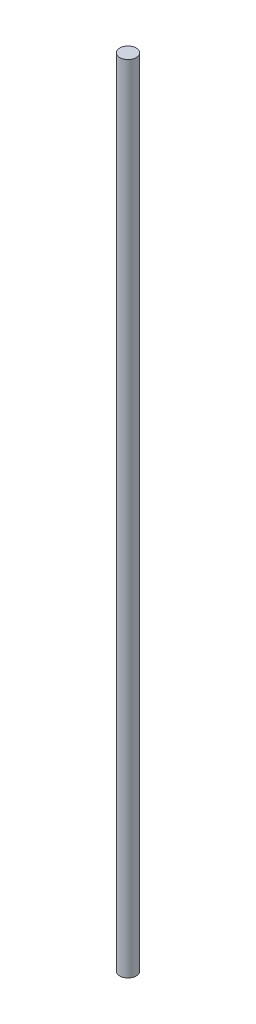
ISO-10303-21;
HEADER;
FILE_DESCRIPTION(('STEP AP214'),'2;1');
FILE_NAME('part.step','',(''),(''),'','','');
FILE_SCHEMA(('AUTOMOTIVE_DESIGN { 1 0 10303 214 1 1 1 1 }'));
ENDSEC;
DATA;
#1=APPLICATION_CONTEXT('core data for automotive mechanical design processes');
#2=APPLICATION_PROTOCOL_DEFINITION('international standard','automotive_design',2000,#1);
#3=PRODUCT_CONTEXT('',#1,'mechanical');
#4=PRODUCT('Part','Part','',(#3));
#5=PRODUCT_RELATED_PRODUCT_CATEGORY('part','',(#4));
#6=PRODUCT_DEFINITION_FORMATION('','',#4);
#7=PRODUCT_DEFINITION_CONTEXT('part definition',#1,'design');
#8=PRODUCT_DEFINITION('design','',#6,#7);
#9=PRODUCT_DEFINITION_SHAPE('','',#8);
#10=(LENGTH_UNIT() NAMED_UNIT(*) SI_UNIT(.MILLI.,.METRE.));
#11=(NAMED_UNIT(*) PLANE_ANGLE_UNIT() SI_UNIT($,.RADIAN.));
#12=(NAMED_UNIT(*) SI_UNIT($,.STERADIAN.) SOLID_ANGLE_UNIT());
#13=UNCERTAINTY_MEASURE_WITH_UNIT(LENGTH_MEASURE(1.E-05),#10,'distance_accuracy_value','');
#14=(GEOMETRIC_REPRESENTATION_CONTEXT(3) GLOBAL_UNCERTAINTY_ASSIGNED_CONTEXT((#13)) GLOBAL_UNIT_ASSIGNED_CONTEXT((#10,
#11,#12)) REPRESENTATION_CONTEXT('',''));
#15=CARTESIAN_POINT('',(0.,0.,0.));
#16=DIRECTION('',(0.,0.,1.));
#17=DIRECTION('',(1.,0.,0.));
#18=AXIS2_PLACEMENT_3D('',#15,#16,#17);
#19=CARTESIAN_POINT('',(-66.8787217069615,304.8,-2.26067909280263));
#20=DIRECTION('',(0.,-1.,0.));
#21=DIRECTION('',(0.,0.,-1.));
#22=AXIS2_PLACEMENT_3D('',#19,#20,#21);
#23=CYLINDRICAL_SURFACE('',#22,3.175);
#24=CARTESIAN_POINT('',(-66.8787217069615,304.8,-2.26067909280263));
#25=DIRECTION('',(0.,1.,0.));
#26=DIRECTION('',(0.,0.,1.));
#27=AXIS2_PLACEMENT_3D('',#24,#25,#26);
#28=CIRCLE('',#27,3.175);
#29=CARTESIAN_POINT('',(-66.8787217069615,304.8,-5.43567909280262));
#30=VERTEX_POINT('',#29);
#31=EDGE_CURVE('E10',#30,#30,#28,.T.);
#32=CARTESIAN_POINT('',(-66.8787217069615,0.,-2.26067909280263));
#33=DIRECTION('',(0.,1.,0.));
#34=DIRECTION('',(0.,0.,1.));
#35=AXIS2_PLACEMENT_3D('',#32,#33,#34);
#36=CIRCLE('',#35,3.175);
#37=CARTESIAN_POINT('',(-66.8787217069615,0.,-5.43567909280262));
#38=VERTEX_POINT('',#37);
#39=EDGE_CURVE('E33',#38,#38,#36,.T.);
#40=CARTESIAN_POINT('',(-66.8787217069615,304.8,-5.43567909280262));
#41=CARTESIAN_POINT('',(-66.8787217069615,301.625,-5.43567909280262));
#42=CARTESIAN_POINT('',(-66.8787217069615,298.45,-5.43567909280262));
#43=CARTESIAN_POINT('',(-66.8787217069615,292.1,-5.43567909280262));
#44=CARTESIAN_POINT('',(-66.8787217069615,288.925,-5.43567909280262));
#45=CARTESIAN_POINT('',(-66.8787217069615,282.575,-5.43567909280262));
#46=CARTESIAN_POINT('',(-66.8787217069615,279.4,-5.43567909280262));
#47=CARTESIAN_POINT('',(-66.8787217069615,273.05,-5.43567909280262));
#48=CARTESIAN_POINT('',(-66.8787217069615,269.875,-5.43567909280262));
#49=CARTESIAN_POINT('',(-66.8787217069615,263.525,-5.43567909280262));
#50=CARTESIAN_POINT('',(-66.8787217069615,260.35,-5.43567909280262));
#51=CARTESIAN_POINT('',(-66.8787217069615,254.,-5.43567909280262));
#52=CARTESIAN_POINT('',(-66.8787217069615,250.825,-5.43567909280262));
#53=CARTESIAN_POINT('',(-66.8787217069615,244.475,-5.43567909280262));
#54=CARTESIAN_POINT('',(-66.8787217069615,241.3,-5.43567909280262));
#55=CARTESIAN_POINT('',(-66.8787217069615,234.95,-5.43567909280262));
#56=CARTESIAN_POINT('',(-66.8787217069615,231.775,-5.43567909280262));
#57=CARTESIAN_POINT('',(-66.8787217069615,225.425,-5.43567909280262));
#58=CARTESIAN_POINT('',(-66.8787217069615,222.25,-5.43567909280262));
#59=CARTESIAN_POINT('',(-66.8787217069615,215.9,-5.43567909280262));
#60=CARTESIAN_POINT('',(-66.8787217069615,212.725,-5.43567909280262));
#61=CARTESIAN_POINT('',(-66.8787217069615,206.375,-5.43567909280262));
#62=CARTESIAN_POINT('',(-66.8787217069615,203.2,-5.43567909280262));
#63=CARTESIAN_POINT('',(-66.8787217069615,196.85,-5.43567909280262));
#64=CARTESIAN_POINT('',(-66.8787217069615,193.675,-5.43567909280262));
#65=CARTESIAN_POINT('',(-66.8787217069615,187.325,-5.43567909280262));
#66=CARTESIAN_POINT('',(-66.8787217069615,184.15,-5.43567909280262));
#67=CARTESIAN_POINT('',(-66.8787217069615,177.8,-5.43567909280262));
#68=CARTESIAN_POINT('',(-66.8787217069615,174.625,-5.43567909280262));
#69=CARTESIAN_POINT('',(-66.8787217069615,168.275,-5.43567909280262));
#70=CARTESIAN_POINT('',(-66.8787217069615,165.1,-5.43567909280262));
#71=CARTESIAN_POINT('',(-66.8787217069615,158.75,-5.43567909280262));
#72=CARTESIAN_POINT('',(-66.8787217069615,155.575,-5.43567909280262));
#73=CARTESIAN_POINT('',(-66.8787217069615,149.225,-5.43567909280262));
#74=CARTESIAN_POINT('',(-66.8787217069615,146.05,-5.43567909280262));
#75=CARTESIAN_POINT('',(-66.8787217069615,139.7,-5.43567909280262));
#76=CARTESIAN_POINT('',(-66.8787217069615,136.525,-5.43567909280262));
#77=CARTESIAN_POINT('',(-66.8787217069615,130.175,-5.43567909280262));
#78=CARTESIAN_POINT('',(-66.8787217069615,127.,-5.43567909280262));
#79=CARTESIAN_POINT('',(-66.8787217069615,120.65,-5.43567909280262));
#80=CARTESIAN_POINT('',(-66.8787217069615,117.475,-5.43567909280262));
#81=CARTESIAN_POINT('',(-66.8787217069615,111.125,-5.43567909280262));
#82=CARTESIAN_POINT('',(-66.8787217069615,107.95,-5.43567909280262));
#83=CARTESIAN_POINT('',(-66.8787217069615,101.6,-5.43567909280262));
#84=CARTESIAN_POINT('',(-66.8787217069615,98.425,-5.43567909280262));
#85=CARTESIAN_POINT('',(-66.8787217069615,92.075,-5.43567909280262));
#86=CARTESIAN_POINT('',(-66.8787217069615,88.9,-5.43567909280262));
#87=CARTESIAN_POINT('',(-66.8787217069615,82.55,-5.43567909280262));
#88=CARTESIAN_POINT('',(-66.8787217069615,79.375,-5.43567909280262));
#89=CARTESIAN_POINT('',(-66.8787217069615,73.025,-5.43567909280262));
#90=CARTESIAN_POINT('',(-66.8787217069615,69.85,-5.43567909280262));
#91=CARTESIAN_POINT('',(-66.8787217069615,63.5,-5.43567909280262));
#92=CARTESIAN_POINT('',(-66.8787217069615,60.325,-5.43567909280262));
#93=CARTESIAN_POINT('',(-66.8787217069615,53.975,-5.43567909280262));
#94=CARTESIAN_POINT('',(-66.8787217069615,50.8,-5.43567909280262));
#95=CARTESIAN_POINT('',(-66.8787217069615,44.45,-5.43567909280262));
#96=CARTESIAN_POINT('',(-66.8787217069615,41.275,-5.43567909280262));
#97=CARTESIAN_POINT('',(-66.8787217069615,34.925,-5.43567909280262));
#98=CARTESIAN_POINT('',(-66.8787217069615,31.75,-5.43567909280262));
#99=CARTESIAN_POINT('',(-66.8787217069615,25.4,-5.43567909280262));
#100=CARTESIAN_POINT('',(-66.8787217069615,22.225,-5.43567909280262));
#101=CARTESIAN_POINT('',(-66.8787217069615,15.875,-5.43567909280262));
#102=CARTESIAN_POINT('',(-66.8787217069615,12.7,-5.43567909280262));
#103=CARTESIAN_POINT('',(-66.8787217069615,6.35,-5.43567909280262));
#104=CARTESIAN_POINT('',(-66.8787217069615,3.175,-5.43567909280262));
#105=CARTESIAN_POINT('',(-66.8787217069615,0.,-5.43567909280262));
#106=B_SPLINE_CURVE_WITH_KNOTS('',3,(#40,#41,#42,#43,#44,#45,#46,#47,#48,#49,#50,#51,#52,#53,
#54,#55,#56,#57,#58,#59,#60,#61,#62,#63,#64,#65,#66,#67,#68,#69,#70,#71,#72,#73,#74,#75,#76,#77,
#78,#79,#80,#81,#82,#83,#84,#85,#86,#87,#88,#89,#90,#91,#92,#93,#94,#95,#96,#97,#98,#99,#100,
#101,#102,#103,#104,#105),.UNSPECIFIED.,.F.,.F.,(4,2,2,2,2,2,2,2,2,2,2,2,2,2,2,2,2,2,2,2,2,2,2,
2,2,2,2,2,2,2,2,2,4),(0.,9.52499999999995,19.05,28.575,38.1,47.625,57.15,66.675,76.2,85.725,
95.2499999999999,104.775,114.3,123.825,133.35,142.875,152.4,161.925,171.45,180.975,190.5,
200.025,209.55,219.075,228.6,238.125,247.65,257.175,266.7,276.225,285.75,295.275,304.8),.UNSPECIFIED.);
#107=EDGE_CURVE('BSEAM30',#30,#38,#106,.T.);
#108=ORIENTED_EDGE('',*,*,#31,.F.);
#109=ORIENTED_EDGE('',*,*,#39,.T.);
#110=ORIENTED_EDGE('',*,*,#107,.T.);
#111=ORIENTED_EDGE('',*,*,#107,.F.);
#112=EDGE_LOOP('',(#108,#110,#109,#111));
#113=FACE_BOUND('',#112,.T.);
#114=ADVANCED_FACE('F30',(#113),#23,.T.);
#115=CARTESIAN_POINT('',(-66.8787217069615,304.8,-2.26067909280263));
#116=DIRECTION('',(0.,1.,0.));
#117=DIRECTION('',(0.,0.,1.));
#118=AXIS2_PLACEMENT_3D('',#115,#116,#117);
#119=PLANE('',#118);
#120=ORIENTED_EDGE('',*,*,#31,.T.);
#121=EDGE_LOOP('',(#120));
#122=FACE_BOUND('',#121,.T.);
#123=ADVANCED_FACE('F45',(#122),#119,.T.);
#124=CARTESIAN_POINT('',(-66.8787217069615,0.,-2.26067909280263));
#125=DIRECTION('',(0.,1.,0.));
#126=DIRECTION('',(0.,0.,1.));
#127=AXIS2_PLACEMENT_3D('',#124,#125,#126);
#128=PLANE('',#127);
#129=ORIENTED_EDGE('',*,*,#39,.F.);
#130=EDGE_LOOP('',(#129));
#131=FACE_BOUND('',#130,.T.);
#132=ADVANCED_FACE('F43',(#131),#128,.F.);
#133=CLOSED_SHELL('',(#114,#123,#132));
#134=MANIFOLD_SOLID_BREP('B2',#133);
#135=ADVANCED_BREP_SHAPE_REPRESENTATION('',(#18,#134),#14);
#136=SHAPE_DEFINITION_REPRESENTATION(#9,#135);
ENDSEC;
END-ISO-10303-21;
